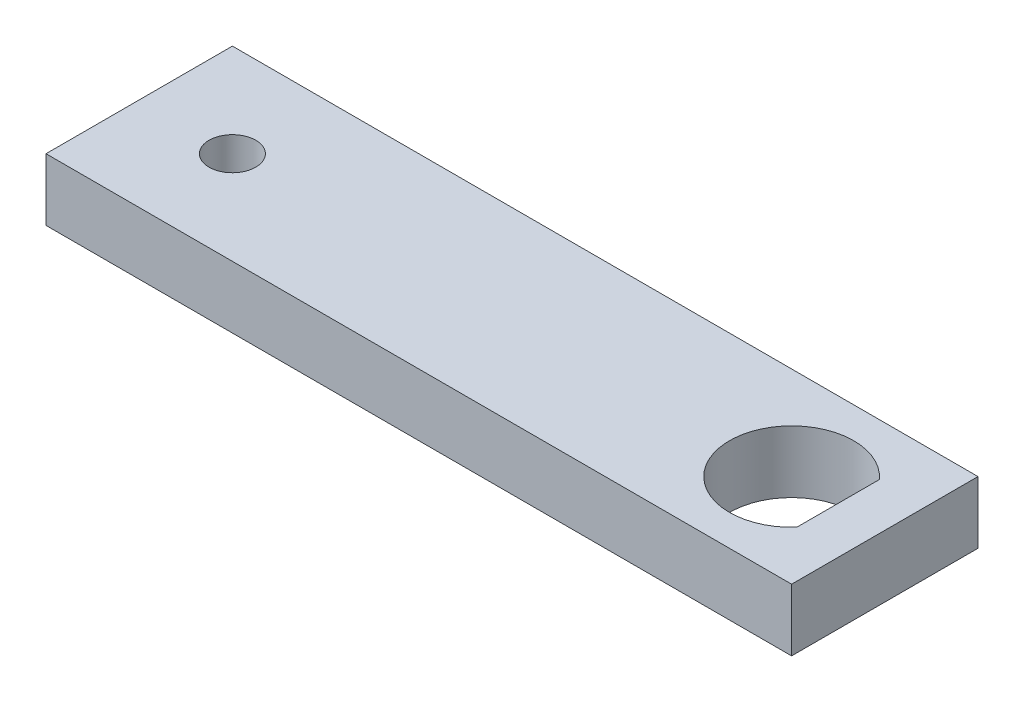
ISO-10303-21;
HEADER;
FILE_DESCRIPTION(('STEP AP214'),'2;1');
FILE_NAME('part.step','',(''),(''),'','','');
FILE_SCHEMA(('AUTOMOTIVE_DESIGN { 1 0 10303 214 1 1 1 1 }'));
ENDSEC;
DATA;
#1=APPLICATION_CONTEXT('core data for automotive mechanical design processes');
#2=APPLICATION_PROTOCOL_DEFINITION('international standard','automotive_design',2000,#1);
#3=PRODUCT_CONTEXT('',#1,'mechanical');
#4=PRODUCT('Part','Part','',(#3));
#5=PRODUCT_RELATED_PRODUCT_CATEGORY('part','',(#4));
#6=PRODUCT_DEFINITION_FORMATION('','',#4);
#7=PRODUCT_DEFINITION_CONTEXT('part definition',#1,'design');
#8=PRODUCT_DEFINITION('design','',#6,#7);
#9=PRODUCT_DEFINITION_SHAPE('','',#8);
#10=(LENGTH_UNIT() NAMED_UNIT(*) SI_UNIT(.MILLI.,.METRE.));
#11=(NAMED_UNIT(*) PLANE_ANGLE_UNIT() SI_UNIT($,.RADIAN.));
#12=(NAMED_UNIT(*) SI_UNIT($,.STERADIAN.) SOLID_ANGLE_UNIT());
#13=UNCERTAINTY_MEASURE_WITH_UNIT(LENGTH_MEASURE(1.E-05),#10,'distance_accuracy_value','');
#14=(GEOMETRIC_REPRESENTATION_CONTEXT(3) GLOBAL_UNCERTAINTY_ASSIGNED_CONTEXT((#13)) GLOBAL_UNIT_ASSIGNED_CONTEXT((#10,
#11,#12)) REPRESENTATION_CONTEXT('',''));
#15=CARTESIAN_POINT('',(0.,0.,0.));
#16=DIRECTION('',(0.,0.,1.));
#17=DIRECTION('',(1.,0.,0.));
#18=AXIS2_PLACEMENT_3D('',#15,#16,#17);
#19=CARTESIAN_POINT('',(9.525,0.,-9.525));
#20=DIRECTION('',(0.,0.,-1.));
#21=DIRECTION('',(-1.,0.,0.));
#22=AXIS2_PLACEMENT_3D('',#19,#20,#21);
#23=PLANE('',#22);
#24=DIRECTION('',(-1.,0.,0.));
#25=VECTOR('',#24,1.);
#26=CARTESIAN_POINT('',(9.525,6.35,-9.525));
#27=LINE('',#26,#25);
#28=CARTESIAN_POINT('',(9.525,6.35,-9.525));
#29=VERTEX_POINT('',#28);
#30=CARTESIAN_POINT('',(-66.675,6.35,-9.525));
#31=VERTEX_POINT('',#30);
#32=EDGE_CURVE('E105',#29,#31,#27,.T.);
#33=ORIENTED_EDGE('',*,*,#32,.F.);
#34=DIRECTION('',(0.,1.,0.));
#35=VECTOR('',#34,1.);
#36=CARTESIAN_POINT('',(9.525,0.,-9.525));
#37=LINE('',#36,#35);
#38=CARTESIAN_POINT('',(9.525,0.,-9.525));
#39=VERTEX_POINT('',#38);
#40=EDGE_CURVE('E11',#39,#29,#37,.T.);
#41=ORIENTED_EDGE('',*,*,#40,.F.);
#42=DIRECTION('',(-1.,0.,0.));
#43=VECTOR('',#42,1.);
#44=CARTESIAN_POINT('',(9.525,0.,-9.525));
#45=LINE('',#44,#43);
#46=CARTESIAN_POINT('',(-66.675,0.,-9.525));
#47=VERTEX_POINT('',#46);
#48=EDGE_CURVE('E107',#39,#47,#45,.T.);
#49=ORIENTED_EDGE('',*,*,#48,.T.);
#50=DIRECTION('',(0.,1.,0.));
#51=VECTOR('',#50,1.);
#52=CARTESIAN_POINT('',(-66.675,0.,-9.525));
#53=LINE('',#52,#51);
#54=EDGE_CURVE('E35',#47,#31,#53,.T.);
#55=ORIENTED_EDGE('',*,*,#54,.T.);
#56=EDGE_LOOP('',(#33,#41,#49,#55));
#57=FACE_BOUND('',#56,.T.);
#58=ADVANCED_FACE('F32',(#57),#23,.T.);
#59=CARTESIAN_POINT('',(9.525,0.,9.525));
#60=DIRECTION('',(1.,0.,0.));
#61=DIRECTION('',(0.,0.,-1.));
#62=AXIS2_PLACEMENT_3D('',#59,#60,#61);
#63=PLANE('',#62);
#64=DIRECTION('',(0.,0.,-1.));
#65=VECTOR('',#64,1.);
#66=CARTESIAN_POINT('',(9.525,6.35,9.525));
#67=LINE('',#66,#65);
#68=CARTESIAN_POINT('',(9.525,6.35,9.525));
#69=VERTEX_POINT('',#68);
#70=EDGE_CURVE('E111',#69,#29,#67,.T.);
#71=ORIENTED_EDGE('',*,*,#70,.F.);
#72=DIRECTION('',(0.,1.,0.));
#73=VECTOR('',#72,1.);
#74=CARTESIAN_POINT('',(9.525,0.,9.525));
#75=LINE('',#74,#73);
#76=CARTESIAN_POINT('',(9.525,0.,9.525));
#77=VERTEX_POINT('',#76);
#78=EDGE_CURVE('E40',#77,#69,#75,.T.);
#79=ORIENTED_EDGE('',*,*,#78,.F.);
#80=DIRECTION('',(0.,0.,-1.));
#81=VECTOR('',#80,1.);
#82=CARTESIAN_POINT('',(9.525,0.,9.525));
#83=LINE('',#82,#81);
#84=EDGE_CURVE('E117',#77,#39,#83,.T.);
#85=ORIENTED_EDGE('',*,*,#84,.T.);
#86=ORIENTED_EDGE('',*,*,#40,.T.);
#87=EDGE_LOOP('',(#71,#79,#85,#86));
#88=FACE_BOUND('',#87,.T.);
#89=ADVANCED_FACE('F143',(#88),#63,.T.);
#90=CARTESIAN_POINT('',(-66.675,0.,9.525));
#91=DIRECTION('',(0.,0.,1.));
#92=DIRECTION('',(1.,0.,0.));
#93=AXIS2_PLACEMENT_3D('',#90,#91,#92);
#94=PLANE('',#93);
#95=DIRECTION('',(1.,0.,0.));
#96=VECTOR('',#95,1.);
#97=CARTESIAN_POINT('',(-66.675,6.35,9.525));
#98=LINE('',#97,#96);
#99=CARTESIAN_POINT('',(-66.675,6.35,9.525));
#100=VERTEX_POINT('',#99);
#101=EDGE_CURVE('E125',#100,#69,#98,.T.);
#102=ORIENTED_EDGE('',*,*,#101,.F.);
#103=DIRECTION('',(0.,1.,0.));
#104=VECTOR('',#103,1.);
#105=CARTESIAN_POINT('',(-66.675,0.,9.525));
#106=LINE('',#105,#104);
#107=CARTESIAN_POINT('',(-66.675,0.,9.525));
#108=VERTEX_POINT('',#107);
#109=EDGE_CURVE('E130',#108,#100,#106,.T.);
#110=ORIENTED_EDGE('',*,*,#109,.F.);
#111=DIRECTION('',(1.,0.,0.));
#112=VECTOR('',#111,1.);
#113=CARTESIAN_POINT('',(-66.675,0.,9.525));
#114=LINE('',#113,#112);
#115=EDGE_CURVE('E114',#108,#77,#114,.T.);
#116=ORIENTED_EDGE('',*,*,#115,.T.);
#117=ORIENTED_EDGE('',*,*,#78,.T.);
#118=EDGE_LOOP('',(#102,#110,#116,#117));
#119=FACE_BOUND('',#118,.T.);
#120=ADVANCED_FACE('F147',(#119),#94,.T.);
#121=CARTESIAN_POINT('',(-66.675,0.,-9.525));
#122=DIRECTION('',(-1.,0.,0.));
#123=DIRECTION('',(0.,0.,1.));
#124=AXIS2_PLACEMENT_3D('',#121,#122,#123);
#125=PLANE('',#124);
#126=DIRECTION('',(0.,0.,1.));
#127=VECTOR('',#126,1.);
#128=CARTESIAN_POINT('',(-66.675,6.35,-9.525));
#129=LINE('',#128,#127);
#130=EDGE_CURVE('E122',#31,#100,#129,.T.);
#131=ORIENTED_EDGE('',*,*,#130,.F.);
#132=ORIENTED_EDGE('',*,*,#54,.F.);
#133=DIRECTION('',(0.,0.,1.));
#134=VECTOR('',#133,1.);
#135=CARTESIAN_POINT('',(-66.675,0.,-9.525));
#136=LINE('',#135,#134);
#137=EDGE_CURVE('E110',#47,#108,#136,.T.);
#138=ORIENTED_EDGE('',*,*,#137,.T.);
#139=ORIENTED_EDGE('',*,*,#109,.T.);
#140=EDGE_LOOP('',(#131,#132,#138,#139));
#141=FACE_BOUND('',#140,.T.);
#142=ADVANCED_FACE('F138',(#141),#125,.T.);
#143=CARTESIAN_POINT('',(0.,0.,0.));
#144=DIRECTION('',(0.,1.,0.));
#145=DIRECTION('',(0.,0.,1.));
#146=AXIS2_PLACEMENT_3D('',#143,#144,#145);
#147=PLANE('',#146);
#148=CARTESIAN_POINT('',(-57.15,0.,0.));
#149=DIRECTION('',(0.,1.,0.));
#150=DIRECTION('',(0.,0.,-1.));
#151=AXIS2_PLACEMENT_3D('',#148,#149,#150);
#152=CIRCLE('',#151,2.3876);
#153=CARTESIAN_POINT('',(-57.15,0.,-2.3876));
#154=VERTEX_POINT('',#153);
#155=EDGE_CURVE('E103',#154,#154,#152,.T.);
#156=ORIENTED_EDGE('',*,*,#155,.T.);
#157=EDGE_LOOP('',(#156));
#158=FACE_BOUND('',#157,.T.);
#159=DIRECTION('',(0.,0.,-1.));
#160=VECTOR('',#159,1.);
#161=CARTESIAN_POINT('',(4.7498,0.,-4.21448691539077));
#162=LINE('',#161,#160);
#163=CARTESIAN_POINT('',(4.7498,0.,4.21448691539077));
#164=VERTEX_POINT('',#163);
#165=CARTESIAN_POINT('',(4.7498,0.,-4.21448691539077));
#166=VERTEX_POINT('',#165);
#167=EDGE_CURVE('E88',#164,#166,#162,.T.);
#168=ORIENTED_EDGE('',*,*,#167,.T.);
#169=CARTESIAN_POINT('',(0.,0.,0.));
#170=DIRECTION('',(0.,1.,0.));
#171=DIRECTION('',(0.,0.,-1.));
#172=AXIS2_PLACEMENT_3D('',#169,#170,#171);
#173=CIRCLE('',#172,6.35);
#174=EDGE_CURVE('E48',#166,#164,#173,.T.);
#175=ORIENTED_EDGE('',*,*,#174,.T.);
#176=EDGE_LOOP('',(#168,#175));
#177=FACE_BOUND('',#176,.T.);
#178=ORIENTED_EDGE('',*,*,#48,.F.);
#179=ORIENTED_EDGE('',*,*,#84,.F.);
#180=ORIENTED_EDGE('',*,*,#115,.F.);
#181=ORIENTED_EDGE('',*,*,#137,.F.);
#182=EDGE_LOOP('',(#178,#179,#180,#181));
#183=FACE_BOUND('',#182,.T.);
#184=ADVANCED_FACE('F94',(#158,#177,#183),#147,.F.);
#185=CARTESIAN_POINT('',(0.,6.35,0.));
#186=DIRECTION('',(0.,1.,0.));
#187=DIRECTION('',(0.,0.,1.));
#188=AXIS2_PLACEMENT_3D('',#185,#186,#187);
#189=PLANE('',#188);
#190=CARTESIAN_POINT('',(-57.15,6.35,0.));
#191=DIRECTION('',(0.,1.,0.));
#192=DIRECTION('',(0.,0.,-1.));
#193=AXIS2_PLACEMENT_3D('',#190,#191,#192);
#194=CIRCLE('',#193,2.3876);
#195=CARTESIAN_POINT('',(-57.15,6.35,-2.3876));
#196=VERTEX_POINT('',#195);
#197=EDGE_CURVE('E100',#196,#196,#194,.T.);
#198=ORIENTED_EDGE('',*,*,#197,.F.);
#199=EDGE_LOOP('',(#198));
#200=FACE_BOUND('',#199,.T.);
#201=CARTESIAN_POINT('',(0.,6.35,0.));
#202=DIRECTION('',(0.,1.,0.));
#203=DIRECTION('',(0.,0.,-1.));
#204=AXIS2_PLACEMENT_3D('',#201,#202,#203);
#205=CIRCLE('',#204,6.35);
#206=CARTESIAN_POINT('',(4.7498,6.35,-4.21448691539077));
#207=VERTEX_POINT('',#206);
#208=CARTESIAN_POINT('',(4.7498,6.35,4.21448691539077));
#209=VERTEX_POINT('',#208);
#210=EDGE_CURVE('E53',#207,#209,#205,.T.);
#211=ORIENTED_EDGE('',*,*,#210,.F.);
#212=DIRECTION('',(0.,0.,-1.));
#213=VECTOR('',#212,1.);
#214=CARTESIAN_POINT('',(4.7498,6.35,-4.21448691539077));
#215=LINE('',#214,#213);
#216=EDGE_CURVE('E96',#209,#207,#215,.T.);
#217=ORIENTED_EDGE('',*,*,#216,.F.);
#218=EDGE_LOOP('',(#211,#217));
#219=FACE_BOUND('',#218,.T.);
#220=ORIENTED_EDGE('',*,*,#32,.T.);
#221=ORIENTED_EDGE('',*,*,#130,.T.);
#222=ORIENTED_EDGE('',*,*,#101,.T.);
#223=ORIENTED_EDGE('',*,*,#70,.T.);
#224=EDGE_LOOP('',(#220,#221,#222,#223));
#225=FACE_BOUND('',#224,.T.);
#226=ADVANCED_FACE('F140',(#200,#219,#225),#189,.T.);
#227=CARTESIAN_POINT('',(0.,0.,0.));
#228=DIRECTION('',(0.,1.,0.));
#229=DIRECTION('',(0.,0.,1.));
#230=AXIS2_PLACEMENT_3D('',#227,#228,#229);
#231=CYLINDRICAL_SURFACE('',#230,6.35);
#232=ORIENTED_EDGE('',*,*,#210,.T.);
#233=DIRECTION('',(0.,1.,0.));
#234=VECTOR('',#233,1.);
#235=CARTESIAN_POINT('',(4.7498,0.,4.21448691539077));
#236=LINE('',#235,#234);
#237=EDGE_CURVE('E81',#164,#209,#236,.T.);
#238=ORIENTED_EDGE('',*,*,#237,.F.);
#239=ORIENTED_EDGE('',*,*,#174,.F.);
#240=DIRECTION('',(0.,1.,0.));
#241=VECTOR('',#240,1.);
#242=CARTESIAN_POINT('',(4.7498,0.,-4.21448691539077));
#243=LINE('',#242,#241);
#244=EDGE_CURVE('E87',#166,#207,#243,.T.);
#245=ORIENTED_EDGE('',*,*,#244,.T.);
#246=EDGE_LOOP('',(#232,#238,#239,#245));
#247=FACE_BOUND('',#246,.T.);
#248=ADVANCED_FACE('F83',(#247),#231,.F.);
#249=CARTESIAN_POINT('',(4.7498,0.,-4.21448691539077));
#250=DIRECTION('',(1.,0.,0.));
#251=DIRECTION('',(0.,0.,-1.));
#252=AXIS2_PLACEMENT_3D('',#249,#250,#251);
#253=PLANE('',#252);
#254=ORIENTED_EDGE('',*,*,#216,.T.);
#255=ORIENTED_EDGE('',*,*,#244,.F.);
#256=ORIENTED_EDGE('',*,*,#167,.F.);
#257=ORIENTED_EDGE('',*,*,#237,.T.);
#258=EDGE_LOOP('',(#254,#255,#256,#257));
#259=FACE_BOUND('',#258,.T.);
#260=ADVANCED_FACE('F91',(#259),#253,.F.);
#261=CARTESIAN_POINT('',(-57.15,0.,0.));
#262=DIRECTION('',(0.,1.,0.));
#263=DIRECTION('',(0.,0.,1.));
#264=AXIS2_PLACEMENT_3D('',#261,#262,#263);
#265=CYLINDRICAL_SURFACE('',#264,2.3876);
#266=ORIENTED_EDGE('',*,*,#155,.F.);
#267=EDGE_LOOP('',(#266));
#268=FACE_BOUND('',#267,.T.);
#269=ORIENTED_EDGE('',*,*,#197,.T.);
#270=EDGE_LOOP('',(#269));
#271=FACE_BOUND('',#270,.T.);
#272=ADVANCED_FACE('F207',(#268,#271),#265,.F.);
#273=CLOSED_SHELL('',(#58,#89,#120,#142,#184,#226,#248,#260,#272));
#274=MANIFOLD_SOLID_BREP('B2',#273);
#275=ADVANCED_BREP_SHAPE_REPRESENTATION('',(#18,#274),#14);
#276=SHAPE_DEFINITION_REPRESENTATION(#9,#275);
ENDSEC;
END-ISO-10303-21;
